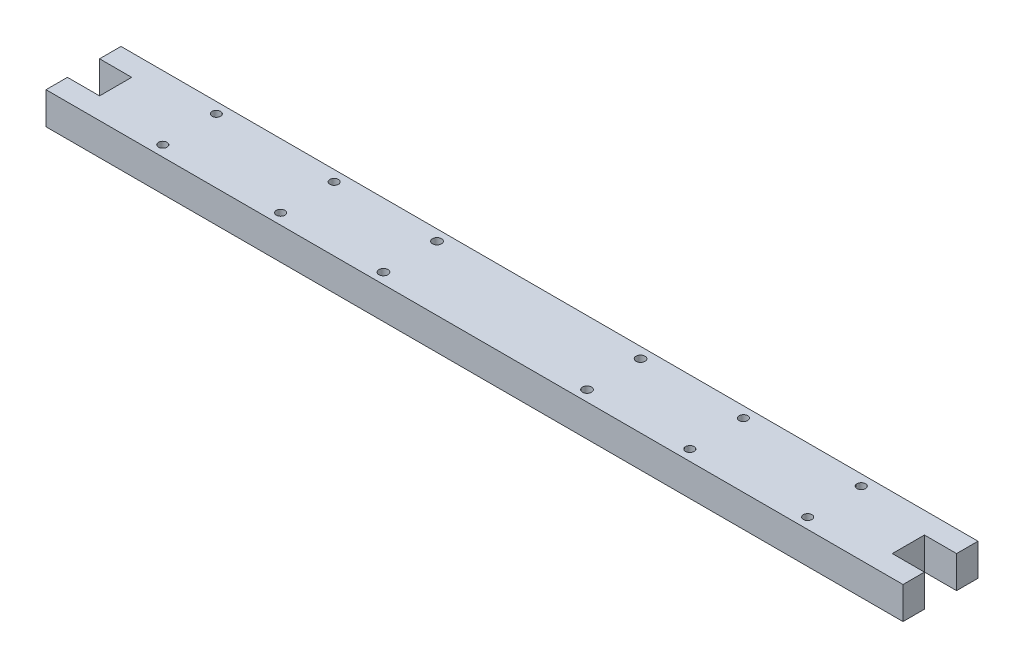
ISO-10303-21;
HEADER;
FILE_DESCRIPTION(('STEP AP214'),'2;1');
FILE_NAME('part.step','',(''),(''),'','','');
FILE_SCHEMA(('AUTOMOTIVE_DESIGN { 1 0 10303 214 1 1 1 1 }'));
ENDSEC;
DATA;
#1=APPLICATION_CONTEXT('core data for automotive mechanical design processes');
#2=APPLICATION_PROTOCOL_DEFINITION('international standard','automotive_design',2000,#1);
#3=PRODUCT_CONTEXT('',#1,'mechanical');
#4=PRODUCT('Part','Part','',(#3));
#5=PRODUCT_RELATED_PRODUCT_CATEGORY('part','',(#4));
#6=PRODUCT_DEFINITION_FORMATION('','',#4);
#7=PRODUCT_DEFINITION_CONTEXT('part definition',#1,'design');
#8=PRODUCT_DEFINITION('design','',#6,#7);
#9=PRODUCT_DEFINITION_SHAPE('','',#8);
#10=(LENGTH_UNIT() NAMED_UNIT(*) SI_UNIT(.MILLI.,.METRE.));
#11=(NAMED_UNIT(*) PLANE_ANGLE_UNIT() SI_UNIT($,.RADIAN.));
#12=(NAMED_UNIT(*) SI_UNIT($,.STERADIAN.) SOLID_ANGLE_UNIT());
#13=UNCERTAINTY_MEASURE_WITH_UNIT(LENGTH_MEASURE(1.E-05),#10,'distance_accuracy_value','');
#14=(GEOMETRIC_REPRESENTATION_CONTEXT(3) GLOBAL_UNCERTAINTY_ASSIGNED_CONTEXT((#13)) GLOBAL_UNIT_ASSIGNED_CONTEXT((#10,
#11,#12)) REPRESENTATION_CONTEXT('',''));
#15=CARTESIAN_POINT('',(0.,0.,0.));
#16=DIRECTION('',(0.,0.,1.));
#17=DIRECTION('',(1.,0.,0.));
#18=AXIS2_PLACEMENT_3D('',#15,#16,#17);
#19=CARTESIAN_POINT('',(0.,15.,-25.));
#20=DIRECTION('',(-1.,0.,0.));
#21=DIRECTION('',(0.,0.,1.));
#22=AXIS2_PLACEMENT_3D('',#19,#20,#21);
#23=PLANE('',#22);
#24=DIRECTION('',(0.,0.,-1.));
#25=VECTOR('',#24,1.);
#26=CARTESIAN_POINT('',(0.,0.,-25.));
#27=LINE('',#26,#25);
#28=CARTESIAN_POINT('',(0.,0.,-25.));
#29=VERTEX_POINT('',#28);
#30=CARTESIAN_POINT('',(0.,0.,-35.));
#31=VERTEX_POINT('',#30);
#32=EDGE_CURVE('E160',#29,#31,#27,.T.);
#33=ORIENTED_EDGE('',*,*,#32,.F.);
#34=DIRECTION('',(0.,-1.,0.));
#35=VECTOR('',#34,1.);
#36=CARTESIAN_POINT('',(0.,15.,-25.));
#37=LINE('',#36,#35);
#38=CARTESIAN_POINT('',(0.,15.,-25.));
#39=VERTEX_POINT('',#38);
#40=EDGE_CURVE('E11',#39,#29,#37,.T.);
#41=ORIENTED_EDGE('',*,*,#40,.F.);
#42=DIRECTION('',(0.,0.,-1.));
#43=VECTOR('',#42,1.);
#44=CARTESIAN_POINT('',(0.,15.,-25.));
#45=LINE('',#44,#43);
#46=CARTESIAN_POINT('',(0.,15.,-35.));
#47=VERTEX_POINT('',#46);
#48=EDGE_CURVE('E188',#39,#47,#45,.T.);
#49=ORIENTED_EDGE('',*,*,#48,.T.);
#50=DIRECTION('',(0.,-1.,0.));
#51=VECTOR('',#50,1.);
#52=CARTESIAN_POINT('',(0.,15.,-35.));
#53=LINE('',#52,#51);
#54=EDGE_CURVE('E105',#47,#31,#53,.T.);
#55=ORIENTED_EDGE('',*,*,#54,.T.);
#56=EDGE_LOOP('',(#33,#41,#49,#55));
#57=FACE_BOUND('',#56,.T.);
#58=ADVANCED_FACE('F37',(#57),#23,.T.);
#59=CARTESIAN_POINT('',(0.,15.,-25.));
#60=DIRECTION('',(0.,0.,-1.));
#61=DIRECTION('',(-1.,0.,0.));
#62=AXIS2_PLACEMENT_3D('',#59,#60,#61);
#63=PLANE('',#62);
#64=DIRECTION('',(1.,0.,0.));
#65=VECTOR('',#64,1.);
#66=CARTESIAN_POINT('',(0.,0.,-25.));
#67=LINE('',#66,#65);
#68=CARTESIAN_POINT('',(15.,0.,-25.));
#69=VERTEX_POINT('',#68);
#70=EDGE_CURVE('E187',#29,#69,#67,.T.);
#71=ORIENTED_EDGE('',*,*,#70,.T.);
#72=DIRECTION('',(0.,-1.,0.));
#73=VECTOR('',#72,1.);
#74=CARTESIAN_POINT('',(15.,15.,-25.));
#75=LINE('',#74,#73);
#76=CARTESIAN_POINT('',(15.,15.,-25.));
#77=VERTEX_POINT('',#76);
#78=EDGE_CURVE('E46',#77,#69,#75,.T.);
#79=ORIENTED_EDGE('',*,*,#78,.F.);
#80=DIRECTION('',(1.,0.,0.));
#81=VECTOR('',#80,1.);
#82=CARTESIAN_POINT('',(0.,15.,-25.));
#83=LINE('',#82,#81);
#84=EDGE_CURVE('E150',#39,#77,#83,.T.);
#85=ORIENTED_EDGE('',*,*,#84,.F.);
#86=ORIENTED_EDGE('',*,*,#40,.T.);
#87=EDGE_LOOP('',(#71,#79,#85,#86));
#88=FACE_BOUND('',#87,.T.);
#89=ADVANCED_FACE('F386',(#88),#63,.F.);
#90=CARTESIAN_POINT('',(15.,15.,-10.));
#91=DIRECTION('',(-1.,0.,0.));
#92=DIRECTION('',(0.,0.,1.));
#93=AXIS2_PLACEMENT_3D('',#90,#91,#92);
#94=PLANE('',#93);
#95=DIRECTION('',(0.,0.,-1.));
#96=VECTOR('',#95,1.);
#97=CARTESIAN_POINT('',(15.,0.,-10.));
#98=LINE('',#97,#96);
#99=CARTESIAN_POINT('',(15.,0.,-10.));
#100=VERTEX_POINT('',#99);
#101=EDGE_CURVE('E136',#100,#69,#98,.T.);
#102=ORIENTED_EDGE('',*,*,#101,.F.);
#103=DIRECTION('',(0.,-1.,0.));
#104=VECTOR('',#103,1.);
#105=CARTESIAN_POINT('',(15.,15.,-10.));
#106=LINE('',#105,#104);
#107=CARTESIAN_POINT('',(15.,15.,-10.));
#108=VERTEX_POINT('',#107);
#109=EDGE_CURVE('E131',#108,#100,#106,.T.);
#110=ORIENTED_EDGE('',*,*,#109,.F.);
#111=DIRECTION('',(0.,0.,-1.));
#112=VECTOR('',#111,1.);
#113=CARTESIAN_POINT('',(15.,15.,-10.));
#114=LINE('',#113,#112);
#115=EDGE_CURVE('E134',#108,#77,#114,.T.);
#116=ORIENTED_EDGE('',*,*,#115,.T.);
#117=ORIENTED_EDGE('',*,*,#78,.T.);
#118=EDGE_LOOP('',(#102,#110,#116,#117));
#119=FACE_BOUND('',#118,.T.);
#120=ADVANCED_FACE('F133',(#119),#94,.T.);
#121=CARTESIAN_POINT('',(0.,15.,-10.));
#122=DIRECTION('',(0.,0.,-1.));
#123=DIRECTION('',(-1.,0.,0.));
#124=AXIS2_PLACEMENT_3D('',#121,#122,#123);
#125=PLANE('',#124);
#126=DIRECTION('',(1.,0.,0.));
#127=VECTOR('',#126,1.);
#128=CARTESIAN_POINT('',(0.,0.,-10.));
#129=LINE('',#128,#127);
#130=CARTESIAN_POINT('',(0.,0.,-10.));
#131=VERTEX_POINT('',#130);
#132=EDGE_CURVE('E184',#131,#100,#129,.T.);
#133=ORIENTED_EDGE('',*,*,#132,.F.);
#134=DIRECTION('',(0.,-1.,0.));
#135=VECTOR('',#134,1.);
#136=CARTESIAN_POINT('',(0.,15.,-10.));
#137=LINE('',#136,#135);
#138=CARTESIAN_POINT('',(0.,15.,-10.));
#139=VERTEX_POINT('',#138);
#140=EDGE_CURVE('E141',#139,#131,#137,.T.);
#141=ORIENTED_EDGE('',*,*,#140,.F.);
#142=DIRECTION('',(1.,0.,0.));
#143=VECTOR('',#142,1.);
#144=CARTESIAN_POINT('',(0.,15.,-10.));
#145=LINE('',#144,#143);
#146=EDGE_CURVE('E148',#139,#108,#145,.T.);
#147=ORIENTED_EDGE('',*,*,#146,.T.);
#148=ORIENTED_EDGE('',*,*,#109,.T.);
#149=EDGE_LOOP('',(#133,#141,#147,#148));
#150=FACE_BOUND('',#149,.T.);
#151=ADVANCED_FACE('F152',(#150),#125,.T.);
#152=CARTESIAN_POINT('',(0.,15.,0.));
#153=DIRECTION('',(-1.,0.,0.));
#154=DIRECTION('',(0.,0.,1.));
#155=AXIS2_PLACEMENT_3D('',#152,#153,#154);
#156=PLANE('',#155);
#157=DIRECTION('',(0.,0.,-1.));
#158=VECTOR('',#157,1.);
#159=CARTESIAN_POINT('',(0.,0.,0.));
#160=LINE('',#159,#158);
#161=CARTESIAN_POINT('',(0.,0.,0.));
#162=VERTEX_POINT('',#161);
#163=EDGE_CURVE('E181',#162,#131,#160,.T.);
#164=ORIENTED_EDGE('',*,*,#163,.F.);
#165=DIRECTION('',(0.,-1.,0.));
#166=VECTOR('',#165,1.);
#167=CARTESIAN_POINT('',(0.,15.,0.));
#168=LINE('',#167,#166);
#169=CARTESIAN_POINT('',(0.,15.,0.));
#170=VERTEX_POINT('',#169);
#171=EDGE_CURVE('E192',#170,#162,#168,.T.);
#172=ORIENTED_EDGE('',*,*,#171,.F.);
#173=DIRECTION('',(0.,0.,-1.));
#174=VECTOR('',#173,1.);
#175=CARTESIAN_POINT('',(0.,15.,0.));
#176=LINE('',#175,#174);
#177=EDGE_CURVE('E153',#170,#139,#176,.T.);
#178=ORIENTED_EDGE('',*,*,#177,.T.);
#179=ORIENTED_EDGE('',*,*,#140,.T.);
#180=EDGE_LOOP('',(#164,#172,#178,#179));
#181=FACE_BOUND('',#180,.T.);
#182=ADVANCED_FACE('F274',(#181),#156,.T.);
#183=CARTESIAN_POINT('',(0.,15.,0.));
#184=DIRECTION('',(0.,0.,-1.));
#185=DIRECTION('',(-1.,0.,0.));
#186=AXIS2_PLACEMENT_3D('',#183,#184,#185);
#187=PLANE('',#186);
#188=DIRECTION('',(1.,0.,0.));
#189=VECTOR('',#188,1.);
#190=CARTESIAN_POINT('',(0.,0.,0.));
#191=LINE('',#190,#189);
#192=CARTESIAN_POINT('',(400.,0.,1.01307850997046E-13));
#193=VERTEX_POINT('',#192);
#194=EDGE_CURVE('E179',#162,#193,#191,.T.);
#195=ORIENTED_EDGE('',*,*,#194,.T.);
#196=DIRECTION('',(0.,-1.,0.));
#197=VECTOR('',#196,1.);
#198=CARTESIAN_POINT('',(400.,15.,1.01307850997046E-13));
#199=LINE('',#198,#197);
#200=CARTESIAN_POINT('',(400.,15.,1.01307850997046E-13));
#201=VERTEX_POINT('',#200);
#202=EDGE_CURVE('E194',#201,#193,#199,.T.);
#203=ORIENTED_EDGE('',*,*,#202,.F.);
#204=DIRECTION('',(1.,0.,0.));
#205=VECTOR('',#204,1.);
#206=CARTESIAN_POINT('',(0.,15.,0.));
#207=LINE('',#206,#205);
#208=EDGE_CURVE('E155',#170,#201,#207,.T.);
#209=ORIENTED_EDGE('',*,*,#208,.F.);
#210=ORIENTED_EDGE('',*,*,#171,.T.);
#211=EDGE_LOOP('',(#195,#203,#209,#210));
#212=FACE_BOUND('',#211,.T.);
#213=ADVANCED_FACE('F271',(#212),#187,.F.);
#214=CARTESIAN_POINT('',(400.,15.,1.01307850997046E-13));
#215=DIRECTION('',(-1.,0.,0.));
#216=DIRECTION('',(0.,0.,1.));
#217=AXIS2_PLACEMENT_3D('',#214,#215,#216);
#218=PLANE('',#217);
#219=DIRECTION('',(0.,0.,-1.));
#220=VECTOR('',#219,1.);
#221=CARTESIAN_POINT('',(400.,0.,1.01307850997046E-13));
#222=LINE('',#221,#220);
#223=CARTESIAN_POINT('',(400.,0.,-9.9999999999999));
#224=VERTEX_POINT('',#223);
#225=EDGE_CURVE('E177',#193,#224,#222,.T.);
#226=ORIENTED_EDGE('',*,*,#225,.T.);
#227=DIRECTION('',(0.,-1.,0.));
#228=VECTOR('',#227,1.);
#229=CARTESIAN_POINT('',(400.,15.,-9.9999999999999));
#230=LINE('',#229,#228);
#231=CARTESIAN_POINT('',(400.,15.,-9.9999999999999));
#232=VERTEX_POINT('',#231);
#233=EDGE_CURVE('E197',#232,#224,#230,.T.);
#234=ORIENTED_EDGE('',*,*,#233,.F.);
#235=DIRECTION('',(0.,0.,-1.));
#236=VECTOR('',#235,1.);
#237=CARTESIAN_POINT('',(400.,15.,1.01307850997046E-13));
#238=LINE('',#237,#236);
#239=EDGE_CURVE('E267',#201,#232,#238,.T.);
#240=ORIENTED_EDGE('',*,*,#239,.F.);
#241=ORIENTED_EDGE('',*,*,#202,.T.);
#242=EDGE_LOOP('',(#226,#234,#240,#241));
#243=FACE_BOUND('',#242,.T.);
#244=ADVANCED_FACE('F266',(#243),#218,.F.);
#245=CARTESIAN_POINT('',(400.,15.,-9.9999999999999));
#246=DIRECTION('',(0.,0.,1.));
#247=DIRECTION('',(1.,0.,0.));
#248=AXIS2_PLACEMENT_3D('',#245,#246,#247);
#249=PLANE('',#248);
#250=DIRECTION('',(-1.,0.,0.));
#251=VECTOR('',#250,1.);
#252=CARTESIAN_POINT('',(400.,0.,-9.9999999999999));
#253=LINE('',#252,#251);
#254=CARTESIAN_POINT('',(385.,0.,-9.9999999999999));
#255=VERTEX_POINT('',#254);
#256=EDGE_CURVE('E175',#224,#255,#253,.T.);
#257=ORIENTED_EDGE('',*,*,#256,.T.);
#258=DIRECTION('',(0.,-1.,0.));
#259=VECTOR('',#258,1.);
#260=CARTESIAN_POINT('',(385.,15.,-9.9999999999999));
#261=LINE('',#260,#259);
#262=CARTESIAN_POINT('',(385.,15.,-9.9999999999999));
#263=VERTEX_POINT('',#262);
#264=EDGE_CURVE('E200',#263,#255,#261,.T.);
#265=ORIENTED_EDGE('',*,*,#264,.F.);
#266=DIRECTION('',(-1.,0.,0.));
#267=VECTOR('',#266,1.);
#268=CARTESIAN_POINT('',(400.,15.,-9.9999999999999));
#269=LINE('',#268,#267);
#270=EDGE_CURVE('E263',#232,#263,#269,.T.);
#271=ORIENTED_EDGE('',*,*,#270,.F.);
#272=ORIENTED_EDGE('',*,*,#233,.T.);
#273=EDGE_LOOP('',(#257,#265,#271,#272));
#274=FACE_BOUND('',#273,.T.);
#275=ADVANCED_FACE('F260',(#274),#249,.F.);
#276=CARTESIAN_POINT('',(385.,15.,-9.9999999999999));
#277=DIRECTION('',(-1.,0.,0.));
#278=DIRECTION('',(0.,0.,1.));
#279=AXIS2_PLACEMENT_3D('',#276,#277,#278);
#280=PLANE('',#279);
#281=DIRECTION('',(0.,0.,-1.));
#282=VECTOR('',#281,1.);
#283=CARTESIAN_POINT('',(385.,0.,-9.9999999999999));
#284=LINE('',#283,#282);
#285=CARTESIAN_POINT('',(385.,0.,-24.9999999999999));
#286=VERTEX_POINT('',#285);
#287=EDGE_CURVE('E172',#255,#286,#284,.T.);
#288=ORIENTED_EDGE('',*,*,#287,.T.);
#289=DIRECTION('',(0.,-1.,0.));
#290=VECTOR('',#289,1.);
#291=CARTESIAN_POINT('',(385.,15.,-24.9999999999999));
#292=LINE('',#291,#290);
#293=CARTESIAN_POINT('',(385.,15.,-24.9999999999999));
#294=VERTEX_POINT('',#293);
#295=EDGE_CURVE('E203',#294,#286,#292,.T.);
#296=ORIENTED_EDGE('',*,*,#295,.F.);
#297=DIRECTION('',(0.,0.,-1.));
#298=VECTOR('',#297,1.);
#299=CARTESIAN_POINT('',(385.,15.,-9.9999999999999));
#300=LINE('',#299,#298);
#301=EDGE_CURVE('E278',#263,#294,#300,.T.);
#302=ORIENTED_EDGE('',*,*,#301,.F.);
#303=ORIENTED_EDGE('',*,*,#264,.T.);
#304=EDGE_LOOP('',(#288,#296,#302,#303));
#305=FACE_BOUND('',#304,.T.);
#306=ADVANCED_FACE('F254',(#305),#280,.F.);
#307=CARTESIAN_POINT('',(400.,15.,-24.9999999999999));
#308=DIRECTION('',(0.,0.,1.));
#309=DIRECTION('',(1.,0.,0.));
#310=AXIS2_PLACEMENT_3D('',#307,#308,#309);
#311=PLANE('',#310);
#312=DIRECTION('',(-1.,0.,0.));
#313=VECTOR('',#312,1.);
#314=CARTESIAN_POINT('',(400.,0.,-24.9999999999999));
#315=LINE('',#314,#313);
#316=CARTESIAN_POINT('',(400.,0.,-24.9999999999999));
#317=VERTEX_POINT('',#316);
#318=EDGE_CURVE('E169',#317,#286,#315,.T.);
#319=ORIENTED_EDGE('',*,*,#318,.F.);
#320=DIRECTION('',(0.,-1.,0.));
#321=VECTOR('',#320,1.);
#322=CARTESIAN_POINT('',(400.,15.,-24.9999999999999));
#323=LINE('',#322,#321);
#324=CARTESIAN_POINT('',(400.,15.,-24.9999999999999));
#325=VERTEX_POINT('',#324);
#326=EDGE_CURVE('E205',#325,#317,#323,.T.);
#327=ORIENTED_EDGE('',*,*,#326,.F.);
#328=DIRECTION('',(-1.,0.,0.));
#329=VECTOR('',#328,1.);
#330=CARTESIAN_POINT('',(400.,15.,-24.9999999999999));
#331=LINE('',#330,#329);
#332=EDGE_CURVE('E251',#325,#294,#331,.T.);
#333=ORIENTED_EDGE('',*,*,#332,.T.);
#334=ORIENTED_EDGE('',*,*,#295,.T.);
#335=EDGE_LOOP('',(#319,#327,#333,#334));
#336=FACE_BOUND('',#335,.T.);
#337=ADVANCED_FACE('F247',(#336),#311,.T.);
#338=CARTESIAN_POINT('',(400.,15.,-24.9999999999999));
#339=DIRECTION('',(-1.,0.,0.));
#340=DIRECTION('',(0.,0.,1.));
#341=AXIS2_PLACEMENT_3D('',#338,#339,#340);
#342=PLANE('',#341);
#343=DIRECTION('',(0.,0.,-1.));
#344=VECTOR('',#343,1.);
#345=CARTESIAN_POINT('',(400.,0.,-24.9999999999999));
#346=LINE('',#345,#344);
#347=CARTESIAN_POINT('',(400.,0.,-34.9999999999999));
#348=VERTEX_POINT('',#347);
#349=EDGE_CURVE('E166',#317,#348,#346,.T.);
#350=ORIENTED_EDGE('',*,*,#349,.T.);
#351=DIRECTION('',(0.,-1.,0.));
#352=VECTOR('',#351,1.);
#353=CARTESIAN_POINT('',(400.,15.,-34.9999999999999));
#354=LINE('',#353,#352);
#355=CARTESIAN_POINT('',(400.,15.,-34.9999999999999));
#356=VERTEX_POINT('',#355);
#357=EDGE_CURVE('E207',#356,#348,#354,.T.);
#358=ORIENTED_EDGE('',*,*,#357,.F.);
#359=DIRECTION('',(0.,0.,-1.));
#360=VECTOR('',#359,1.);
#361=CARTESIAN_POINT('',(400.,15.,-24.9999999999999));
#362=LINE('',#361,#360);
#363=EDGE_CURVE('E281',#325,#356,#362,.T.);
#364=ORIENTED_EDGE('',*,*,#363,.F.);
#365=ORIENTED_EDGE('',*,*,#326,.T.);
#366=EDGE_LOOP('',(#350,#358,#364,#365));
#367=FACE_BOUND('',#366,.T.);
#368=ADVANCED_FACE('F243',(#367),#342,.F.);
#369=CARTESIAN_POINT('',(0.,15.,-35.));
#370=DIRECTION('',(0.,0.,-1.));
#371=DIRECTION('',(-1.,0.,0.));
#372=AXIS2_PLACEMENT_3D('',#369,#370,#371);
#373=PLANE('',#372);
#374=DIRECTION('',(1.,0.,0.));
#375=VECTOR('',#374,1.);
#376=CARTESIAN_POINT('',(0.,0.,-35.));
#377=LINE('',#376,#375);
#378=EDGE_CURVE('E163',#31,#348,#377,.T.);
#379=ORIENTED_EDGE('',*,*,#378,.F.);
#380=ORIENTED_EDGE('',*,*,#54,.F.);
#381=DIRECTION('',(1.,0.,0.));
#382=VECTOR('',#381,1.);
#383=CARTESIAN_POINT('',(0.,15.,-35.));
#384=LINE('',#383,#382);
#385=EDGE_CURVE('E240',#47,#356,#384,.T.);
#386=ORIENTED_EDGE('',*,*,#385,.T.);
#387=ORIENTED_EDGE('',*,*,#357,.T.);
#388=EDGE_LOOP('',(#379,#380,#386,#387));
#389=FACE_BOUND('',#388,.T.);
#390=ADVANCED_FACE('F238',(#389),#373,.T.);
#391=CARTESIAN_POINT('',(0.,15.,0.));
#392=DIRECTION('',(0.,-1.,0.));
#393=DIRECTION('',(0.,0.,-1.));
#394=AXIS2_PLACEMENT_3D('',#391,#392,#393);
#395=PLANE('',#394);
#396=CARTESIAN_POINT('',(49.5,15.,-30.));
#397=DIRECTION('',(0.,1.,0.));
#398=DIRECTION('',(0.,0.,-1.));
#399=AXIS2_PLACEMENT_3D('',#396,#397,#398);
#400=CIRCLE('',#399,2.);
#401=CARTESIAN_POINT('',(49.5,15.,-32.));
#402=VERTEX_POINT('',#401);
#403=EDGE_CURVE('E315',#402,#402,#400,.T.);
#404=ORIENTED_EDGE('',*,*,#403,.F.);
#405=EDGE_LOOP('',(#404));
#406=FACE_BOUND('',#405,.T.);
#407=CARTESIAN_POINT('',(295.5,15.,-30.));
#408=DIRECTION('',(0.,1.,0.));
#409=DIRECTION('',(0.,0.,1.));
#410=AXIS2_PLACEMENT_3D('',#407,#408,#409);
#411=CIRCLE('',#410,2.);
#412=CARTESIAN_POINT('',(295.5,15.,-28.));
#413=VERTEX_POINT('',#412);
#414=EDGE_CURVE('E322',#413,#413,#411,.T.);
#415=ORIENTED_EDGE('',*,*,#414,.F.);
#416=EDGE_LOOP('',(#415));
#417=FACE_BOUND('',#416,.T.);
#418=CARTESIAN_POINT('',(350.5,15.,-30.));
#419=DIRECTION('',(0.,1.,0.));
#420=DIRECTION('',(0.,0.,1.));
#421=AXIS2_PLACEMENT_3D('',#418,#419,#420);
#422=CIRCLE('',#421,2.);
#423=CARTESIAN_POINT('',(350.5,15.,-28.));
#424=VERTEX_POINT('',#423);
#425=EDGE_CURVE('E303',#424,#424,#422,.T.);
#426=ORIENTED_EDGE('',*,*,#425,.F.);
#427=EDGE_LOOP('',(#426));
#428=FACE_BOUND('',#427,.T.);
#429=CARTESIAN_POINT('',(295.5,15.,-5.00000000000002));
#430=DIRECTION('',(0.,1.,0.));
#431=DIRECTION('',(0.,0.,1.));
#432=AXIS2_PLACEMENT_3D('',#429,#430,#431);
#433=CIRCLE('',#432,2.);
#434=CARTESIAN_POINT('',(295.5,15.,-3.00000000000002));
#435=VERTEX_POINT('',#434);
#436=EDGE_CURVE('E310',#435,#435,#433,.T.);
#437=ORIENTED_EDGE('',*,*,#436,.F.);
#438=EDGE_LOOP('',(#437));
#439=FACE_BOUND('',#438,.T.);
#440=CARTESIAN_POINT('',(104.5,15.,-30.));
#441=DIRECTION('',(0.,1.,0.));
#442=DIRECTION('',(0.,0.,-1.));
#443=AXIS2_PLACEMENT_3D('',#440,#441,#442);
#444=CIRCLE('',#443,2.);
#445=CARTESIAN_POINT('',(104.5,15.,-32.));
#446=VERTEX_POINT('',#445);
#447=EDGE_CURVE('E339',#446,#446,#444,.T.);
#448=ORIENTED_EDGE('',*,*,#447,.F.);
#449=EDGE_LOOP('',(#448));
#450=FACE_BOUND('',#449,.T.);
#451=CARTESIAN_POINT('',(104.5,15.,-5.00000000000002));
#452=DIRECTION('',(0.,1.,0.));
#453=DIRECTION('',(0.,0.,-1.));
#454=AXIS2_PLACEMENT_3D('',#451,#452,#453);
#455=CIRCLE('',#454,2.);
#456=CARTESIAN_POINT('',(104.5,15.,-7.00000000000001));
#457=VERTEX_POINT('',#456);
#458=EDGE_CURVE('E333',#457,#457,#455,.T.);
#459=ORIENTED_EDGE('',*,*,#458,.F.);
#460=EDGE_LOOP('',(#459));
#461=FACE_BOUND('',#460,.T.);
#462=CARTESIAN_POINT('',(49.5,15.,-5.00000000000002));
#463=DIRECTION('',(0.,1.,0.));
#464=DIRECTION('',(0.,0.,-1.));
#465=AXIS2_PLACEMENT_3D('',#462,#463,#464);
#466=CIRCLE('',#465,2.);
#467=CARTESIAN_POINT('',(49.5,15.,-7.00000000000002));
#468=VERTEX_POINT('',#467);
#469=EDGE_CURVE('E327',#468,#468,#466,.T.);
#470=ORIENTED_EDGE('',*,*,#469,.F.);
#471=EDGE_LOOP('',(#470));
#472=FACE_BOUND('',#471,.T.);
#473=CARTESIAN_POINT('',(350.5,15.,-5.00000000000002));
#474=DIRECTION('',(0.,1.,0.));
#475=DIRECTION('',(0.,0.,1.));
#476=AXIS2_PLACEMENT_3D('',#473,#474,#475);
#477=CIRCLE('',#476,2.);
#478=CARTESIAN_POINT('',(350.5,15.,-3.00000000000003));
#479=VERTEX_POINT('',#478);
#480=EDGE_CURVE('E297',#479,#479,#477,.T.);
#481=ORIENTED_EDGE('',*,*,#480,.F.);
#482=EDGE_LOOP('',(#481));
#483=FACE_BOUND('',#482,.T.);
#484=CARTESIAN_POINT('',(152.5,15.,-30.));
#485=DIRECTION('',(0.,1.,0.));
#486=DIRECTION('',(0.,0.,1.));
#487=AXIS2_PLACEMENT_3D('',#484,#485,#486);
#488=CIRCLE('',#487,2.10000000000002);
#489=CARTESIAN_POINT('',(152.5,15.,-27.9));
#490=VERTEX_POINT('',#489);
#491=EDGE_CURVE('E287',#490,#490,#488,.T.);
#492=ORIENTED_EDGE('',*,*,#491,.F.);
#493=EDGE_LOOP('',(#492));
#494=FACE_BOUND('',#493,.T.);
#495=CARTESIAN_POINT('',(247.5,15.,-5.00000000000004));
#496=DIRECTION('',(0.,1.,0.));
#497=DIRECTION('',(0.,0.,1.));
#498=AXIS2_PLACEMENT_3D('',#495,#496,#497);
#499=CIRCLE('',#498,2.09999999999999);
#500=CARTESIAN_POINT('',(247.5,15.,-2.90000000000005));
#501=VERTEX_POINT('',#500);
#502=EDGE_CURVE('E288',#501,#501,#499,.T.);
#503=ORIENTED_EDGE('',*,*,#502,.F.);
#504=EDGE_LOOP('',(#503));
#505=FACE_BOUND('',#504,.T.);
#506=CARTESIAN_POINT('',(247.5,15.,-30.));
#507=DIRECTION('',(0.,1.,0.));
#508=DIRECTION('',(0.,0.,1.));
#509=AXIS2_PLACEMENT_3D('',#506,#507,#508);
#510=CIRCLE('',#509,2.09999999999999);
#511=CARTESIAN_POINT('',(247.5,15.,-27.9000000000001));
#512=VERTEX_POINT('',#511);
#513=EDGE_CURVE('E291',#512,#512,#510,.T.);
#514=ORIENTED_EDGE('',*,*,#513,.F.);
#515=EDGE_LOOP('',(#514));
#516=FACE_BOUND('',#515,.T.);
#517=CARTESIAN_POINT('',(152.5,15.,-5.00000000000004));
#518=DIRECTION('',(0.,1.,0.));
#519=DIRECTION('',(0.,0.,1.));
#520=AXIS2_PLACEMENT_3D('',#517,#518,#519);
#521=CIRCLE('',#520,2.09999999999999);
#522=CARTESIAN_POINT('',(152.5,15.,-2.90000000000005));
#523=VERTEX_POINT('',#522);
#524=EDGE_CURVE('E214',#523,#523,#521,.T.);
#525=ORIENTED_EDGE('',*,*,#524,.F.);
#526=EDGE_LOOP('',(#525));
#527=FACE_BOUND('',#526,.T.);
#528=ORIENTED_EDGE('',*,*,#48,.F.);
#529=ORIENTED_EDGE('',*,*,#84,.T.);
#530=ORIENTED_EDGE('',*,*,#115,.F.);
#531=ORIENTED_EDGE('',*,*,#146,.F.);
#532=ORIENTED_EDGE('',*,*,#177,.F.);
#533=ORIENTED_EDGE('',*,*,#208,.T.);
#534=ORIENTED_EDGE('',*,*,#239,.T.);
#535=ORIENTED_EDGE('',*,*,#270,.T.);
#536=ORIENTED_EDGE('',*,*,#301,.T.);
#537=ORIENTED_EDGE('',*,*,#332,.F.);
#538=ORIENTED_EDGE('',*,*,#363,.T.);
#539=ORIENTED_EDGE('',*,*,#385,.F.);
#540=EDGE_LOOP('',(#528,#529,#530,#531,#532,#533,#534,#535,#536,#537,#538,#539));
#541=FACE_BOUND('',#540,.T.);
#542=ADVANCED_FACE('F146',(#406,#417,#428,#439,#450,#461,#472,#483,#494,#505,#516,#527,#541),
#395,.F.);
#543=CARTESIAN_POINT('',(0.,0.,0.));
#544=DIRECTION('',(0.,-1.,0.));
#545=DIRECTION('',(0.,0.,-1.));
#546=AXIS2_PLACEMENT_3D('',#543,#544,#545);
#547=PLANE('',#546);
#548=CARTESIAN_POINT('',(49.5,0.,-30.));
#549=DIRECTION('',(0.,1.,0.));
#550=DIRECTION('',(0.,0.,-1.));
#551=AXIS2_PLACEMENT_3D('',#548,#549,#550);
#552=CIRCLE('',#551,2.);
#553=CARTESIAN_POINT('',(49.5,0.,-32.));
#554=VERTEX_POINT('',#553);
#555=EDGE_CURVE('E318',#554,#554,#552,.T.);
#556=ORIENTED_EDGE('',*,*,#555,.T.);
#557=EDGE_LOOP('',(#556));
#558=FACE_BOUND('',#557,.T.);
#559=CARTESIAN_POINT('',(295.5,0.,-30.));
#560=DIRECTION('',(0.,1.,0.));
#561=DIRECTION('',(0.,0.,1.));
#562=AXIS2_PLACEMENT_3D('',#559,#560,#561);
#563=CIRCLE('',#562,2.);
#564=CARTESIAN_POINT('',(295.5,0.,-28.));
#565=VERTEX_POINT('',#564);
#566=EDGE_CURVE('E307',#565,#565,#563,.T.);
#567=ORIENTED_EDGE('',*,*,#566,.T.);
#568=EDGE_LOOP('',(#567));
#569=FACE_BOUND('',#568,.T.);
#570=CARTESIAN_POINT('',(350.5,0.,-30.));
#571=DIRECTION('',(0.,1.,0.));
#572=DIRECTION('',(0.,0.,1.));
#573=AXIS2_PLACEMENT_3D('',#570,#571,#572);
#574=CIRCLE('',#573,2.);
#575=CARTESIAN_POINT('',(350.5,0.,-28.));
#576=VERTEX_POINT('',#575);
#577=EDGE_CURVE('E306',#576,#576,#574,.T.);
#578=ORIENTED_EDGE('',*,*,#577,.T.);
#579=EDGE_LOOP('',(#578));
#580=FACE_BOUND('',#579,.T.);
#581=CARTESIAN_POINT('',(295.5,0.,-5.00000000000002));
#582=DIRECTION('',(0.,1.,0.));
#583=DIRECTION('',(0.,0.,1.));
#584=AXIS2_PLACEMENT_3D('',#581,#582,#583);
#585=CIRCLE('',#584,2.);
#586=CARTESIAN_POINT('',(295.5,0.,-3.00000000000002));
#587=VERTEX_POINT('',#586);
#588=EDGE_CURVE('E300',#587,#587,#585,.T.);
#589=ORIENTED_EDGE('',*,*,#588,.T.);
#590=EDGE_LOOP('',(#589));
#591=FACE_BOUND('',#590,.T.);
#592=CARTESIAN_POINT('',(104.5,0.,-30.));
#593=DIRECTION('',(0.,1.,0.));
#594=DIRECTION('',(0.,0.,-1.));
#595=AXIS2_PLACEMENT_3D('',#592,#593,#594);
#596=CIRCLE('',#595,2.);
#597=CARTESIAN_POINT('',(104.5,0.,-32.));
#598=VERTEX_POINT('',#597);
#599=EDGE_CURVE('E319',#598,#598,#596,.T.);
#600=ORIENTED_EDGE('',*,*,#599,.T.);
#601=EDGE_LOOP('',(#600));
#602=FACE_BOUND('',#601,.T.);
#603=CARTESIAN_POINT('',(104.5,0.,-5.00000000000002));
#604=DIRECTION('',(0.,1.,0.));
#605=DIRECTION('',(0.,0.,-1.));
#606=AXIS2_PLACEMENT_3D('',#603,#604,#605);
#607=CIRCLE('',#606,2.);
#608=CARTESIAN_POINT('',(104.5,0.,-7.00000000000001));
#609=VERTEX_POINT('',#608);
#610=EDGE_CURVE('E336',#609,#609,#607,.T.);
#611=ORIENTED_EDGE('',*,*,#610,.T.);
#612=EDGE_LOOP('',(#611));
#613=FACE_BOUND('',#612,.T.);
#614=CARTESIAN_POINT('',(49.5,0.,-5.00000000000002));
#615=DIRECTION('',(0.,1.,0.));
#616=DIRECTION('',(0.,0.,-1.));
#617=AXIS2_PLACEMENT_3D('',#614,#615,#616);
#618=CIRCLE('',#617,2.);
#619=CARTESIAN_POINT('',(49.5,0.,-7.00000000000002));
#620=VERTEX_POINT('',#619);
#621=EDGE_CURVE('E330',#620,#620,#618,.T.);
#622=ORIENTED_EDGE('',*,*,#621,.T.);
#623=EDGE_LOOP('',(#622));
#624=FACE_BOUND('',#623,.T.);
#625=CARTESIAN_POINT('',(350.5,0.,-5.00000000000002));
#626=DIRECTION('',(0.,1.,0.));
#627=DIRECTION('',(0.,0.,1.));
#628=AXIS2_PLACEMENT_3D('',#625,#626,#627);
#629=CIRCLE('',#628,2.);
#630=CARTESIAN_POINT('',(350.5,0.,-3.00000000000003));
#631=VERTEX_POINT('',#630);
#632=EDGE_CURVE('E296',#631,#631,#629,.T.);
#633=ORIENTED_EDGE('',*,*,#632,.T.);
#634=EDGE_LOOP('',(#633));
#635=FACE_BOUND('',#634,.T.);
#636=CARTESIAN_POINT('',(152.5,0.,-30.));
#637=DIRECTION('',(0.,-1.,0.));
#638=DIRECTION('',(0.,0.,-1.));
#639=AXIS2_PLACEMENT_3D('',#636,#637,#638);
#640=CIRCLE('',#639,2.10000000000002);
#641=CARTESIAN_POINT('',(152.5,0.,-32.1000000000001));
#642=VERTEX_POINT('',#641);
#643=EDGE_CURVE('E40',#642,#642,#640,.T.);
#644=ORIENTED_EDGE('',*,*,#643,.F.);
#645=EDGE_LOOP('',(#644));
#646=FACE_BOUND('',#645,.T.);
#647=CARTESIAN_POINT('',(247.5,0.,-5.00000000000004));
#648=DIRECTION('',(0.,-1.,0.));
#649=DIRECTION('',(0.,0.,-1.));
#650=AXIS2_PLACEMENT_3D('',#647,#648,#649);
#651=CIRCLE('',#650,2.09999999999999);
#652=CARTESIAN_POINT('',(247.5,0.,-7.10000000000003));
#653=VERTEX_POINT('',#652);
#654=EDGE_CURVE('E216',#653,#653,#651,.T.);
#655=ORIENTED_EDGE('',*,*,#654,.F.);
#656=EDGE_LOOP('',(#655));
#657=FACE_BOUND('',#656,.T.);
#658=CARTESIAN_POINT('',(247.5,0.,-30.));
#659=DIRECTION('',(0.,-1.,0.));
#660=DIRECTION('',(0.,0.,-1.));
#661=AXIS2_PLACEMENT_3D('',#658,#659,#660);
#662=CIRCLE('',#661,2.09999999999999);
#663=CARTESIAN_POINT('',(247.5,0.,-32.1));
#664=VERTEX_POINT('',#663);
#665=EDGE_CURVE('E213',#664,#664,#662,.T.);
#666=ORIENTED_EDGE('',*,*,#665,.F.);
#667=EDGE_LOOP('',(#666));
#668=FACE_BOUND('',#667,.T.);
#669=CARTESIAN_POINT('',(152.5,0.,-5.00000000000004));
#670=DIRECTION('',(0.,-1.,0.));
#671=DIRECTION('',(0.,0.,-1.));
#672=AXIS2_PLACEMENT_3D('',#669,#670,#671);
#673=CIRCLE('',#672,2.09999999999999);
#674=CARTESIAN_POINT('',(152.5,0.,-7.10000000000003));
#675=VERTEX_POINT('',#674);
#676=EDGE_CURVE('E210',#675,#675,#673,.T.);
#677=ORIENTED_EDGE('',*,*,#676,.F.);
#678=EDGE_LOOP('',(#677));
#679=FACE_BOUND('',#678,.T.);
#680=ORIENTED_EDGE('',*,*,#32,.T.);
#681=ORIENTED_EDGE('',*,*,#378,.T.);
#682=ORIENTED_EDGE('',*,*,#349,.F.);
#683=ORIENTED_EDGE('',*,*,#318,.T.);
#684=ORIENTED_EDGE('',*,*,#287,.F.);
#685=ORIENTED_EDGE('',*,*,#256,.F.);
#686=ORIENTED_EDGE('',*,*,#225,.F.);
#687=ORIENTED_EDGE('',*,*,#194,.F.);
#688=ORIENTED_EDGE('',*,*,#163,.T.);
#689=ORIENTED_EDGE('',*,*,#132,.T.);
#690=ORIENTED_EDGE('',*,*,#101,.T.);
#691=ORIENTED_EDGE('',*,*,#70,.F.);
#692=EDGE_LOOP('',(#680,#681,#682,#683,#684,#685,#686,#687,#688,#689,#690,#691));
#693=FACE_BOUND('',#692,.T.);
#694=ADVANCED_FACE('F226',(#558,#569,#580,#591,#602,#613,#624,#635,#646,#657,#668,#679,#693),
#547,.T.);
#695=CARTESIAN_POINT('',(152.5,-15.,-5.00000000000004));
#696=DIRECTION('',(0.,1.,0.));
#697=DIRECTION('',(0.,0.,1.));
#698=AXIS2_PLACEMENT_3D('',#695,#696,#697);
#699=CYLINDRICAL_SURFACE('',#698,2.09999999999999);
#700=ORIENTED_EDGE('',*,*,#676,.T.);
#701=EDGE_LOOP('',(#700));
#702=FACE_BOUND('',#701,.T.);
#703=ORIENTED_EDGE('',*,*,#524,.T.);
#704=EDGE_LOOP('',(#703));
#705=FACE_BOUND('',#704,.T.);
#706=ADVANCED_FACE('F229',(#702,#705),#699,.F.);
#707=CARTESIAN_POINT('',(247.5,-15.,-30.));
#708=DIRECTION('',(0.,1.,0.));
#709=DIRECTION('',(0.,0.,1.));
#710=AXIS2_PLACEMENT_3D('',#707,#708,#709);
#711=CYLINDRICAL_SURFACE('',#710,2.09999999999999);
#712=ORIENTED_EDGE('',*,*,#665,.T.);
#713=EDGE_LOOP('',(#712));
#714=FACE_BOUND('',#713,.T.);
#715=ORIENTED_EDGE('',*,*,#513,.T.);
#716=EDGE_LOOP('',(#715));
#717=FACE_BOUND('',#716,.T.);
#718=ADVANCED_FACE('F374',(#714,#717),#711,.F.);
#719=CARTESIAN_POINT('',(247.5,-15.,-5.00000000000004));
#720=DIRECTION('',(0.,1.,0.));
#721=DIRECTION('',(0.,0.,1.));
#722=AXIS2_PLACEMENT_3D('',#719,#720,#721);
#723=CYLINDRICAL_SURFACE('',#722,2.09999999999999);
#724=ORIENTED_EDGE('',*,*,#654,.T.);
#725=EDGE_LOOP('',(#724));
#726=FACE_BOUND('',#725,.T.);
#727=ORIENTED_EDGE('',*,*,#502,.T.);
#728=EDGE_LOOP('',(#727));
#729=FACE_BOUND('',#728,.T.);
#730=ADVANCED_FACE('F381',(#726,#729),#723,.F.);
#731=CARTESIAN_POINT('',(152.5,-15.,-30.));
#732=DIRECTION('',(0.,1.,0.));
#733=DIRECTION('',(0.,0.,1.));
#734=AXIS2_PLACEMENT_3D('',#731,#732,#733);
#735=CYLINDRICAL_SURFACE('',#734,2.10000000000002);
#736=ORIENTED_EDGE('',*,*,#643,.T.);
#737=EDGE_LOOP('',(#736));
#738=FACE_BOUND('',#737,.T.);
#739=ORIENTED_EDGE('',*,*,#491,.T.);
#740=EDGE_LOOP('',(#739));
#741=FACE_BOUND('',#740,.T.);
#742=ADVANCED_FACE('F223',(#738,#741),#735,.F.);
#743=CARTESIAN_POINT('',(350.5,0.,-5.00000000000002));
#744=DIRECTION('',(0.,1.,0.));
#745=DIRECTION('',(0.,0.,1.));
#746=AXIS2_PLACEMENT_3D('',#743,#744,#745);
#747=CYLINDRICAL_SURFACE('',#746,2.);
#748=ORIENTED_EDGE('',*,*,#632,.F.);
#749=EDGE_LOOP('',(#748));
#750=FACE_BOUND('',#749,.T.);
#751=ORIENTED_EDGE('',*,*,#480,.T.);
#752=EDGE_LOOP('',(#751));
#753=FACE_BOUND('',#752,.T.);
#754=ADVANCED_FACE('F432',(#750,#753),#747,.F.);
#755=CARTESIAN_POINT('',(49.5,0.,-5.00000000000002));
#756=DIRECTION('',(0.,1.,0.));
#757=DIRECTION('',(0.,0.,1.));
#758=AXIS2_PLACEMENT_3D('',#755,#756,#757);
#759=CYLINDRICAL_SURFACE('',#758,2.);
#760=ORIENTED_EDGE('',*,*,#621,.F.);
#761=EDGE_LOOP('',(#760));
#762=FACE_BOUND('',#761,.T.);
#763=ORIENTED_EDGE('',*,*,#469,.T.);
#764=EDGE_LOOP('',(#763));
#765=FACE_BOUND('',#764,.T.);
#766=ADVANCED_FACE('F437',(#762,#765),#759,.F.);
#767=CARTESIAN_POINT('',(104.5,0.,-5.00000000000002));
#768=DIRECTION('',(0.,1.,0.));
#769=DIRECTION('',(0.,0.,1.));
#770=AXIS2_PLACEMENT_3D('',#767,#768,#769);
#771=CYLINDRICAL_SURFACE('',#770,2.);
#772=ORIENTED_EDGE('',*,*,#610,.F.);
#773=EDGE_LOOP('',(#772));
#774=FACE_BOUND('',#773,.T.);
#775=ORIENTED_EDGE('',*,*,#458,.T.);
#776=EDGE_LOOP('',(#775));
#777=FACE_BOUND('',#776,.T.);
#778=ADVANCED_FACE('F351',(#774,#777),#771,.F.);
#779=CARTESIAN_POINT('',(104.5,0.,-30.));
#780=DIRECTION('',(0.,1.,0.));
#781=DIRECTION('',(0.,0.,1.));
#782=AXIS2_PLACEMENT_3D('',#779,#780,#781);
#783=CYLINDRICAL_SURFACE('',#782,2.);
#784=ORIENTED_EDGE('',*,*,#599,.F.);
#785=EDGE_LOOP('',(#784));
#786=FACE_BOUND('',#785,.T.);
#787=ORIENTED_EDGE('',*,*,#447,.T.);
#788=EDGE_LOOP('',(#787));
#789=FACE_BOUND('',#788,.T.);
#790=ADVANCED_FACE('F347',(#786,#789),#783,.F.);
#791=CARTESIAN_POINT('',(295.5,0.,-5.00000000000002));
#792=DIRECTION('',(0.,1.,0.));
#793=DIRECTION('',(0.,0.,1.));
#794=AXIS2_PLACEMENT_3D('',#791,#792,#793);
#795=CYLINDRICAL_SURFACE('',#794,2.);
#796=ORIENTED_EDGE('',*,*,#588,.F.);
#797=EDGE_LOOP('',(#796));
#798=FACE_BOUND('',#797,.T.);
#799=ORIENTED_EDGE('',*,*,#436,.T.);
#800=EDGE_LOOP('',(#799));
#801=FACE_BOUND('',#800,.T.);
#802=ADVANCED_FACE('F350',(#798,#801),#795,.F.);
#803=CARTESIAN_POINT('',(350.5,0.,-30.));
#804=DIRECTION('',(0.,1.,0.));
#805=DIRECTION('',(0.,0.,1.));
#806=AXIS2_PLACEMENT_3D('',#803,#804,#805);
#807=CYLINDRICAL_SURFACE('',#806,2.);
#808=ORIENTED_EDGE('',*,*,#577,.F.);
#809=EDGE_LOOP('',(#808));
#810=FACE_BOUND('',#809,.T.);
#811=ORIENTED_EDGE('',*,*,#425,.T.);
#812=EDGE_LOOP('',(#811));
#813=FACE_BOUND('',#812,.T.);
#814=ADVANCED_FACE('F473',(#810,#813),#807,.F.);
#815=CARTESIAN_POINT('',(295.5,0.,-30.));
#816=DIRECTION('',(0.,1.,0.));
#817=DIRECTION('',(0.,0.,1.));
#818=AXIS2_PLACEMENT_3D('',#815,#816,#817);
#819=CYLINDRICAL_SURFACE('',#818,2.);
#820=ORIENTED_EDGE('',*,*,#566,.F.);
#821=EDGE_LOOP('',(#820));
#822=FACE_BOUND('',#821,.T.);
#823=ORIENTED_EDGE('',*,*,#414,.T.);
#824=EDGE_LOOP('',(#823));
#825=FACE_BOUND('',#824,.T.);
#826=ADVANCED_FACE('F483',(#822,#825),#819,.F.);
#827=CARTESIAN_POINT('',(49.5,0.,-30.));
#828=DIRECTION('',(0.,1.,0.));
#829=DIRECTION('',(0.,0.,1.));
#830=AXIS2_PLACEMENT_3D('',#827,#828,#829);
#831=CYLINDRICAL_SURFACE('',#830,2.);
#832=ORIENTED_EDGE('',*,*,#555,.F.);
#833=EDGE_LOOP('',(#832));
#834=FACE_BOUND('',#833,.T.);
#835=ORIENTED_EDGE('',*,*,#403,.T.);
#836=EDGE_LOOP('',(#835));
#837=FACE_BOUND('',#836,.T.);
#838=ADVANCED_FACE('F493',(#834,#837),#831,.F.);
#839=CLOSED_SHELL('',(#58,#89,#120,#151,#182,#213,#244,#275,#306,#337,#368,#390,#542,#694,#706,
#718,#730,#742,#754,#766,#778,#790,#802,#814,#826,#838));
#840=MANIFOLD_SOLID_BREP('B2',#839);
#841=ADVANCED_BREP_SHAPE_REPRESENTATION('',(#18,#840),#14);
#842=SHAPE_DEFINITION_REPRESENTATION(#9,#841);
ENDSEC;
END-ISO-10303-21;
